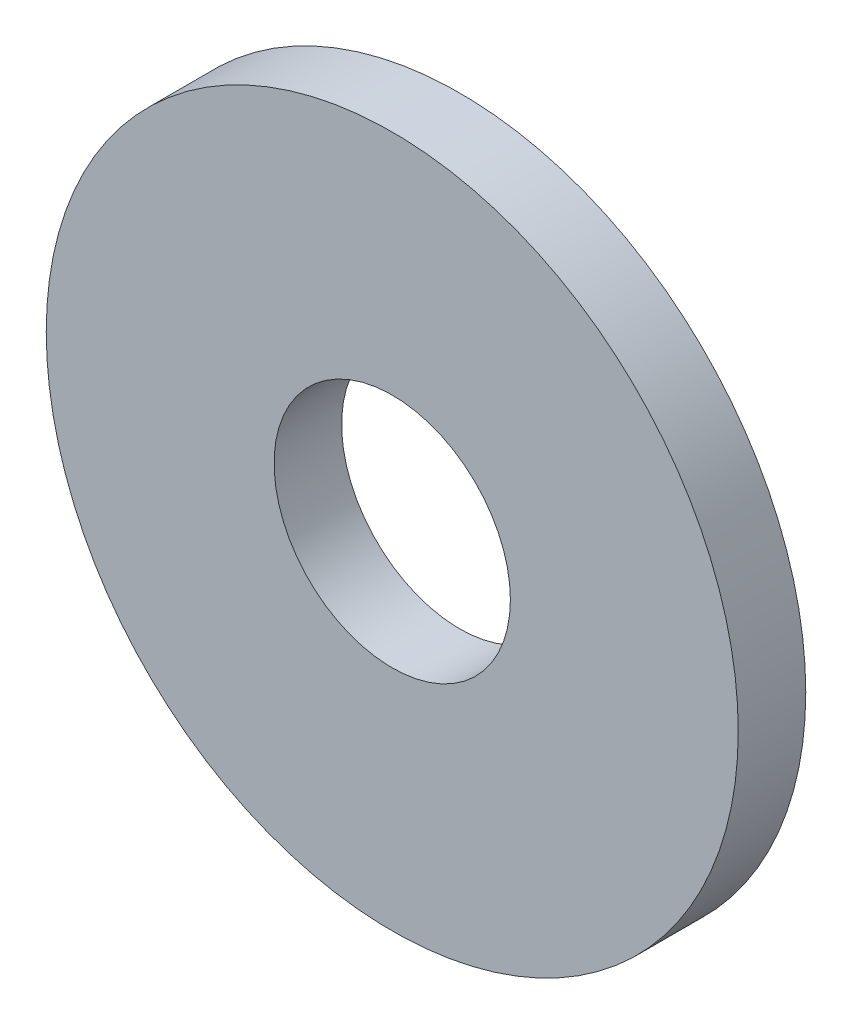
ISO-10303-21;
HEADER;
FILE_DESCRIPTION(('STEP AP214'),'2;1');
FILE_NAME('part.step','',(''),(''),'','','');
FILE_SCHEMA(('AUTOMOTIVE_DESIGN { 1 0 10303 214 1 1 1 1 }'));
ENDSEC;
DATA;
#1=APPLICATION_CONTEXT('core data for automotive mechanical design processes');
#2=APPLICATION_PROTOCOL_DEFINITION('international standard','automotive_design',2000,#1);
#3=PRODUCT_CONTEXT('',#1,'mechanical');
#4=PRODUCT('Part','Part','',(#3));
#5=PRODUCT_RELATED_PRODUCT_CATEGORY('part','',(#4));
#6=PRODUCT_DEFINITION_FORMATION('','',#4);
#7=PRODUCT_DEFINITION_CONTEXT('part definition',#1,'design');
#8=PRODUCT_DEFINITION('design','',#6,#7);
#9=PRODUCT_DEFINITION_SHAPE('','',#8);
#10=(LENGTH_UNIT() NAMED_UNIT(*) SI_UNIT(.MILLI.,.METRE.));
#11=(NAMED_UNIT(*) PLANE_ANGLE_UNIT() SI_UNIT($,.RADIAN.));
#12=(NAMED_UNIT(*) SI_UNIT($,.STERADIAN.) SOLID_ANGLE_UNIT());
#13=UNCERTAINTY_MEASURE_WITH_UNIT(LENGTH_MEASURE(1.E-05),#10,'distance_accuracy_value','');
#14=(GEOMETRIC_REPRESENTATION_CONTEXT(3) GLOBAL_UNCERTAINTY_ASSIGNED_CONTEXT((#13)) GLOBAL_UNIT_ASSIGNED_CONTEXT((#10,
#11,#12)) REPRESENTATION_CONTEXT('',''));
#15=CARTESIAN_POINT('',(0.,0.,0.));
#16=DIRECTION('',(0.,0.,1.));
#17=DIRECTION('',(1.,0.,0.));
#18=AXIS2_PLACEMENT_3D('',#15,#16,#17);
#19=CARTESIAN_POINT('',(0.,0.,0.507999999999998));
#20=DIRECTION('',(0.,0.,1.));
#21=DIRECTION('',(1.,0.,0.));
#22=AXIS2_PLACEMENT_3D('',#19,#20,#21);
#23=PLANE('',#22);
#24=CARTESIAN_POINT('',(0.,0.,0.507999999999998));
#25=DIRECTION('',(0.,0.,1.));
#26=DIRECTION('',(1.,0.,0.));
#27=AXIS2_PLACEMENT_3D('',#24,#25,#26);
#28=CIRCLE('',#27,5.207);
#29=CARTESIAN_POINT('',(5.207,0.,0.507999999999998));
#30=VERTEX_POINT('',#29);
#31=EDGE_CURVE('E10',#30,#30,#28,.T.);
#32=ORIENTED_EDGE('',*,*,#31,.T.);
#33=EDGE_LOOP('',(#32));
#34=FACE_BOUND('',#33,.T.);
#35=CARTESIAN_POINT('',(0.,0.,0.507999999999998));
#36=DIRECTION('',(0.,0.,1.));
#37=DIRECTION('',(1.,0.,0.));
#38=AXIS2_PLACEMENT_3D('',#35,#36,#37);
#39=CIRCLE('',#38,1.778);
#40=CARTESIAN_POINT('',(1.778,0.,0.507999999999998));
#41=VERTEX_POINT('',#40);
#42=EDGE_CURVE('E40',#41,#41,#39,.T.);
#43=ORIENTED_EDGE('',*,*,#42,.F.);
#44=EDGE_LOOP('',(#43));
#45=FACE_BOUND('',#44,.T.);
#46=ADVANCED_FACE('F33',(#34,#45),#23,.T.);
#47=CARTESIAN_POINT('',(0.,0.,0.507999999999998));
#48=DIRECTION('',(0.,0.,-1.));
#49=DIRECTION('',(-1.,0.,0.));
#50=AXIS2_PLACEMENT_3D('',#47,#48,#49);
#51=CYLINDRICAL_SURFACE('',#50,5.207);
#52=ORIENTED_EDGE('',*,*,#31,.F.);
#53=EDGE_LOOP('',(#52));
#54=FACE_BOUND('',#53,.T.);
#55=CARTESIAN_POINT('',(0.,0.,-0.508000000000002));
#56=DIRECTION('',(0.,0.,1.));
#57=DIRECTION('',(1.,0.,0.));
#58=AXIS2_PLACEMENT_3D('',#55,#56,#57);
#59=CIRCLE('',#58,5.207);
#60=CARTESIAN_POINT('',(5.207,0.,-0.508000000000002));
#61=VERTEX_POINT('',#60);
#62=EDGE_CURVE('E44',#61,#61,#59,.T.);
#63=ORIENTED_EDGE('',*,*,#62,.T.);
#64=EDGE_LOOP('',(#63));
#65=FACE_BOUND('',#64,.T.);
#66=ADVANCED_FACE('F35',(#54,#65),#51,.T.);
#67=CARTESIAN_POINT('',(0.,0.,0.507999999999998));
#68=DIRECTION('',(0.,0.,-1.));
#69=DIRECTION('',(-1.,0.,0.));
#70=AXIS2_PLACEMENT_3D('',#67,#68,#69);
#71=CYLINDRICAL_SURFACE('',#70,1.778);
#72=ORIENTED_EDGE('',*,*,#42,.T.);
#73=EDGE_LOOP('',(#72));
#74=FACE_BOUND('',#73,.T.);
#75=CARTESIAN_POINT('',(0.,0.,-0.508000000000002));
#76=DIRECTION('',(0.,0.,1.));
#77=DIRECTION('',(1.,0.,0.));
#78=AXIS2_PLACEMENT_3D('',#75,#76,#77);
#79=CIRCLE('',#78,1.778);
#80=CARTESIAN_POINT('',(1.778,0.,-0.508000000000002));
#81=VERTEX_POINT('',#80);
#82=EDGE_CURVE('E48',#81,#81,#79,.T.);
#83=ORIENTED_EDGE('',*,*,#82,.F.);
#84=EDGE_LOOP('',(#83));
#85=FACE_BOUND('',#84,.T.);
#86=ADVANCED_FACE('F57',(#74,#85),#71,.F.);
#87=CARTESIAN_POINT('',(0.,0.,-0.508000000000002));
#88=DIRECTION('',(0.,0.,1.));
#89=DIRECTION('',(1.,0.,0.));
#90=AXIS2_PLACEMENT_3D('',#87,#88,#89);
#91=PLANE('',#90);
#92=ORIENTED_EDGE('',*,*,#82,.T.);
#93=EDGE_LOOP('',(#92));
#94=FACE_BOUND('',#93,.T.);
#95=ORIENTED_EDGE('',*,*,#62,.F.);
#96=EDGE_LOOP('',(#95));
#97=FACE_BOUND('',#96,.T.);
#98=ADVANCED_FACE('F54',(#94,#97),#91,.F.);
#99=CLOSED_SHELL('',(#46,#66,#86,#98));
#100=MANIFOLD_SOLID_BREP('B2',#99);
#101=ADVANCED_BREP_SHAPE_REPRESENTATION('',(#18,#100),#14);
#102=SHAPE_DEFINITION_REPRESENTATION(#9,#101);
ENDSEC;
END-ISO-10303-21;
